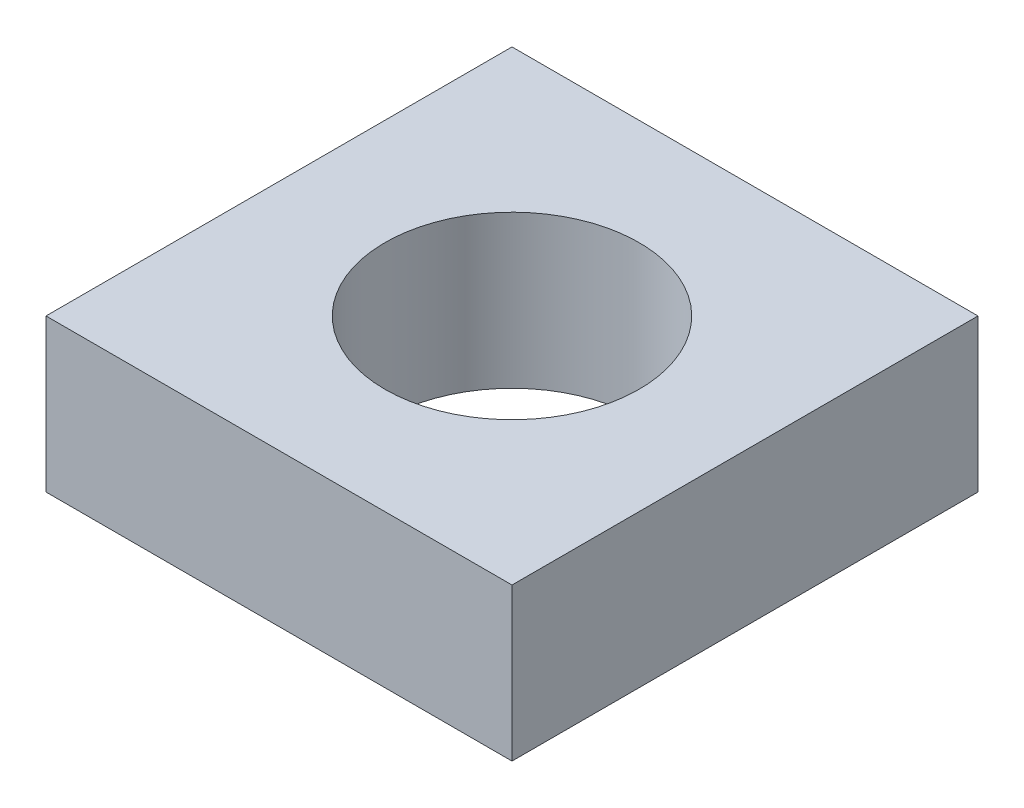
ISO-10303-21;
HEADER;
FILE_DESCRIPTION(('STEP AP214'),'2;1');
FILE_NAME('part.step','',(''),(''),'','','');
FILE_SCHEMA(('AUTOMOTIVE_DESIGN { 1 0 10303 214 1 1 1 1 }'));
ENDSEC;
DATA;
#1=APPLICATION_CONTEXT('core data for automotive mechanical design processes');
#2=APPLICATION_PROTOCOL_DEFINITION('international standard','automotive_design',2000,#1);
#3=PRODUCT_CONTEXT('',#1,'mechanical');
#4=PRODUCT('Part','Part','',(#3));
#5=PRODUCT_RELATED_PRODUCT_CATEGORY('part','',(#4));
#6=PRODUCT_DEFINITION_FORMATION('','',#4);
#7=PRODUCT_DEFINITION_CONTEXT('part definition',#1,'design');
#8=PRODUCT_DEFINITION('design','',#6,#7);
#9=PRODUCT_DEFINITION_SHAPE('','',#8);
#10=(LENGTH_UNIT() NAMED_UNIT(*) SI_UNIT(.MILLI.,.METRE.));
#11=(NAMED_UNIT(*) PLANE_ANGLE_UNIT() SI_UNIT($,.RADIAN.));
#12=(NAMED_UNIT(*) SI_UNIT($,.STERADIAN.) SOLID_ANGLE_UNIT());
#13=UNCERTAINTY_MEASURE_WITH_UNIT(LENGTH_MEASURE(1.E-05),#10,'distance_accuracy_value','');
#14=(GEOMETRIC_REPRESENTATION_CONTEXT(3) GLOBAL_UNCERTAINTY_ASSIGNED_CONTEXT((#13)) GLOBAL_UNIT_ASSIGNED_CONTEXT((#10,
#11,#12)) REPRESENTATION_CONTEXT('',''));
#15=CARTESIAN_POINT('',(0.,0.,0.));
#16=DIRECTION('',(0.,0.,1.));
#17=DIRECTION('',(1.,0.,0.));
#18=AXIS2_PLACEMENT_3D('',#15,#16,#17);
#19=CARTESIAN_POINT('',(0.,1.8,0.));
#20=DIRECTION('',(0.,-1.,0.));
#21=DIRECTION('',(0.,0.,-1.));
#22=AXIS2_PLACEMENT_3D('',#19,#20,#21);
#23=PLANE('',#22);
#24=DIRECTION('',(0.,0.,1.));
#25=VECTOR('',#24,1.);
#26=CARTESIAN_POINT('',(0.,1.8,0.));
#27=LINE('',#26,#25);
#28=CARTESIAN_POINT('',(0.,1.8,-5.5));
#29=VERTEX_POINT('',#28);
#30=CARTESIAN_POINT('',(0.,1.8,0.));
#31=VERTEX_POINT('',#30);
#32=EDGE_CURVE('E98',#29,#31,#27,.T.);
#33=ORIENTED_EDGE('',*,*,#32,.T.);
#34=DIRECTION('',(1.,0.,0.));
#35=VECTOR('',#34,1.);
#36=CARTESIAN_POINT('',(0.,1.8,0.));
#37=LINE('',#36,#35);
#38=CARTESIAN_POINT('',(5.5,1.8,0.));
#39=VERTEX_POINT('',#38);
#40=EDGE_CURVE('E93',#31,#39,#37,.T.);
#41=ORIENTED_EDGE('',*,*,#40,.T.);
#42=DIRECTION('',(0.,0.,-1.));
#43=VECTOR('',#42,1.);
#44=CARTESIAN_POINT('',(5.5,1.8,0.));
#45=LINE('',#44,#43);
#46=CARTESIAN_POINT('',(5.5,1.8,-5.5));
#47=VERTEX_POINT('',#46);
#48=EDGE_CURVE('E96',#39,#47,#45,.T.);
#49=ORIENTED_EDGE('',*,*,#48,.T.);
#50=DIRECTION('',(-1.,0.,0.));
#51=VECTOR('',#50,1.);
#52=CARTESIAN_POINT('',(0.,1.8,-5.5));
#53=LINE('',#52,#51);
#54=EDGE_CURVE('E63',#47,#29,#53,.T.);
#55=ORIENTED_EDGE('',*,*,#54,.T.);
#56=EDGE_LOOP('',(#33,#41,#49,#55));
#57=FACE_BOUND('',#56,.T.);
#58=CARTESIAN_POINT('',(2.75,1.8,-2.75));
#59=DIRECTION('',(0.,1.,0.));
#60=DIRECTION('',(0.,0.,1.));
#61=AXIS2_PLACEMENT_3D('',#58,#59,#60);
#62=CIRCLE('',#61,1.5);
#63=CARTESIAN_POINT('',(2.75,1.8,-1.25));
#64=VERTEX_POINT('',#63);
#65=EDGE_CURVE('E118',#64,#64,#62,.T.);
#66=ORIENTED_EDGE('',*,*,#65,.F.);
#67=EDGE_LOOP('',(#66));
#68=FACE_BOUND('',#67,.T.);
#69=ADVANCED_FACE('F45',(#57,#68),#23,.F.);
#70=CARTESIAN_POINT('',(0.,0.,0.));
#71=DIRECTION('',(0.,-1.,0.));
#72=DIRECTION('',(0.,0.,-1.));
#73=AXIS2_PLACEMENT_3D('',#70,#71,#72);
#74=PLANE('',#73);
#75=DIRECTION('',(0.,0.,1.));
#76=VECTOR('',#75,1.);
#77=CARTESIAN_POINT('',(0.,0.,0.));
#78=LINE('',#77,#76);
#79=CARTESIAN_POINT('',(0.,0.,-5.5));
#80=VERTEX_POINT('',#79);
#81=CARTESIAN_POINT('',(0.,0.,0.));
#82=VERTEX_POINT('',#81);
#83=EDGE_CURVE('E114',#80,#82,#78,.T.);
#84=ORIENTED_EDGE('',*,*,#83,.F.);
#85=DIRECTION('',(-1.,0.,0.));
#86=VECTOR('',#85,1.);
#87=CARTESIAN_POINT('',(0.,0.,-5.5));
#88=LINE('',#87,#86);
#89=CARTESIAN_POINT('',(5.5,0.,-5.5));
#90=VERTEX_POINT('',#89);
#91=EDGE_CURVE('E86',#90,#80,#88,.T.);
#92=ORIENTED_EDGE('',*,*,#91,.F.);
#93=DIRECTION('',(0.,0.,-1.));
#94=VECTOR('',#93,1.);
#95=CARTESIAN_POINT('',(5.5,0.,0.));
#96=LINE('',#95,#94);
#97=CARTESIAN_POINT('',(5.5,0.,0.));
#98=VERTEX_POINT('',#97);
#99=EDGE_CURVE('E80',#98,#90,#96,.T.);
#100=ORIENTED_EDGE('',*,*,#99,.F.);
#101=DIRECTION('',(1.,0.,0.));
#102=VECTOR('',#101,1.);
#103=CARTESIAN_POINT('',(0.,0.,0.));
#104=LINE('',#103,#102);
#105=EDGE_CURVE('E103',#82,#98,#104,.T.);
#106=ORIENTED_EDGE('',*,*,#105,.F.);
#107=EDGE_LOOP('',(#84,#92,#100,#106));
#108=FACE_BOUND('',#107,.T.);
#109=CARTESIAN_POINT('',(2.75,0.,-2.75));
#110=DIRECTION('',(0.,1.,0.));
#111=DIRECTION('',(0.,0.,1.));
#112=AXIS2_PLACEMENT_3D('',#109,#110,#111);
#113=CIRCLE('',#112,1.5);
#114=CARTESIAN_POINT('',(2.75,0.,-1.25));
#115=VERTEX_POINT('',#114);
#116=EDGE_CURVE('E136',#115,#115,#113,.T.);
#117=ORIENTED_EDGE('',*,*,#116,.T.);
#118=EDGE_LOOP('',(#117));
#119=FACE_BOUND('',#118,.T.);
#120=ADVANCED_FACE('F131',(#108,#119),#74,.T.);
#121=CARTESIAN_POINT('',(0.,1.8,0.));
#122=DIRECTION('',(1.,0.,0.));
#123=DIRECTION('',(0.,0.,-1.));
#124=AXIS2_PLACEMENT_3D('',#121,#122,#123);
#125=PLANE('',#124);
#126=ORIENTED_EDGE('',*,*,#83,.T.);
#127=DIRECTION('',(0.,-1.,0.));
#128=VECTOR('',#127,1.);
#129=CARTESIAN_POINT('',(0.,1.8,0.));
#130=LINE('',#129,#128);
#131=EDGE_CURVE('E11',#31,#82,#130,.T.);
#132=ORIENTED_EDGE('',*,*,#131,.F.);
#133=ORIENTED_EDGE('',*,*,#32,.F.);
#134=DIRECTION('',(0.,-1.,0.));
#135=VECTOR('',#134,1.);
#136=CARTESIAN_POINT('',(0.,1.8,-5.5));
#137=LINE('',#136,#135);
#138=EDGE_CURVE('E110',#29,#80,#137,.T.);
#139=ORIENTED_EDGE('',*,*,#138,.T.);
#140=EDGE_LOOP('',(#126,#132,#133,#139));
#141=FACE_BOUND('',#140,.T.);
#142=ADVANCED_FACE('F47',(#141),#125,.F.);
#143=CARTESIAN_POINT('',(0.,1.8,0.));
#144=DIRECTION('',(0.,0.,-1.));
#145=DIRECTION('',(-1.,0.,0.));
#146=AXIS2_PLACEMENT_3D('',#143,#144,#145);
#147=PLANE('',#146);
#148=ORIENTED_EDGE('',*,*,#105,.T.);
#149=DIRECTION('',(0.,-1.,0.));
#150=VECTOR('',#149,1.);
#151=CARTESIAN_POINT('',(5.5,1.8,0.));
#152=LINE('',#151,#150);
#153=EDGE_CURVE('E55',#39,#98,#152,.T.);
#154=ORIENTED_EDGE('',*,*,#153,.F.);
#155=ORIENTED_EDGE('',*,*,#40,.F.);
#156=ORIENTED_EDGE('',*,*,#131,.T.);
#157=EDGE_LOOP('',(#148,#154,#155,#156));
#158=FACE_BOUND('',#157,.T.);
#159=ADVANCED_FACE('F102',(#158),#147,.F.);
#160=CARTESIAN_POINT('',(5.5,1.8,0.));
#161=DIRECTION('',(-1.,0.,0.));
#162=DIRECTION('',(0.,0.,1.));
#163=AXIS2_PLACEMENT_3D('',#160,#161,#162);
#164=PLANE('',#163);
#165=ORIENTED_EDGE('',*,*,#99,.T.);
#166=DIRECTION('',(0.,-1.,0.));
#167=VECTOR('',#166,1.);
#168=CARTESIAN_POINT('',(5.5,1.8,-5.5));
#169=LINE('',#168,#167);
#170=EDGE_CURVE('E105',#47,#90,#169,.T.);
#171=ORIENTED_EDGE('',*,*,#170,.F.);
#172=ORIENTED_EDGE('',*,*,#48,.F.);
#173=ORIENTED_EDGE('',*,*,#153,.T.);
#174=EDGE_LOOP('',(#165,#171,#172,#173));
#175=FACE_BOUND('',#174,.T.);
#176=ADVANCED_FACE('F106',(#175),#164,.F.);
#177=CARTESIAN_POINT('',(0.,1.8,-5.5));
#178=DIRECTION('',(0.,0.,1.));
#179=DIRECTION('',(1.,0.,0.));
#180=AXIS2_PLACEMENT_3D('',#177,#178,#179);
#181=PLANE('',#180);
#182=ORIENTED_EDGE('',*,*,#91,.T.);
#183=ORIENTED_EDGE('',*,*,#138,.F.);
#184=ORIENTED_EDGE('',*,*,#54,.F.);
#185=ORIENTED_EDGE('',*,*,#170,.T.);
#186=EDGE_LOOP('',(#182,#183,#184,#185));
#187=FACE_BOUND('',#186,.T.);
#188=ADVANCED_FACE('F128',(#187),#181,.F.);
#189=CARTESIAN_POINT('',(2.75,1.8,-2.75));
#190=DIRECTION('',(0.,-1.,0.));
#191=DIRECTION('',(0.,0.,-1.));
#192=AXIS2_PLACEMENT_3D('',#189,#190,#191);
#193=CYLINDRICAL_SURFACE('',#192,1.5);
#194=ORIENTED_EDGE('',*,*,#65,.T.);
#195=EDGE_LOOP('',(#194));
#196=FACE_BOUND('',#195,.T.);
#197=ORIENTED_EDGE('',*,*,#116,.F.);
#198=EDGE_LOOP('',(#197));
#199=FACE_BOUND('',#198,.T.);
#200=ADVANCED_FACE('F144',(#196,#199),#193,.F.);
#201=CLOSED_SHELL('',(#69,#120,#142,#159,#176,#188,#200));
#202=MANIFOLD_SOLID_BREP('B2',#201);
#203=ADVANCED_BREP_SHAPE_REPRESENTATION('',(#18,#202),#14);
#204=SHAPE_DEFINITION_REPRESENTATION(#9,#203);
ENDSEC;
END-ISO-10303-21;
